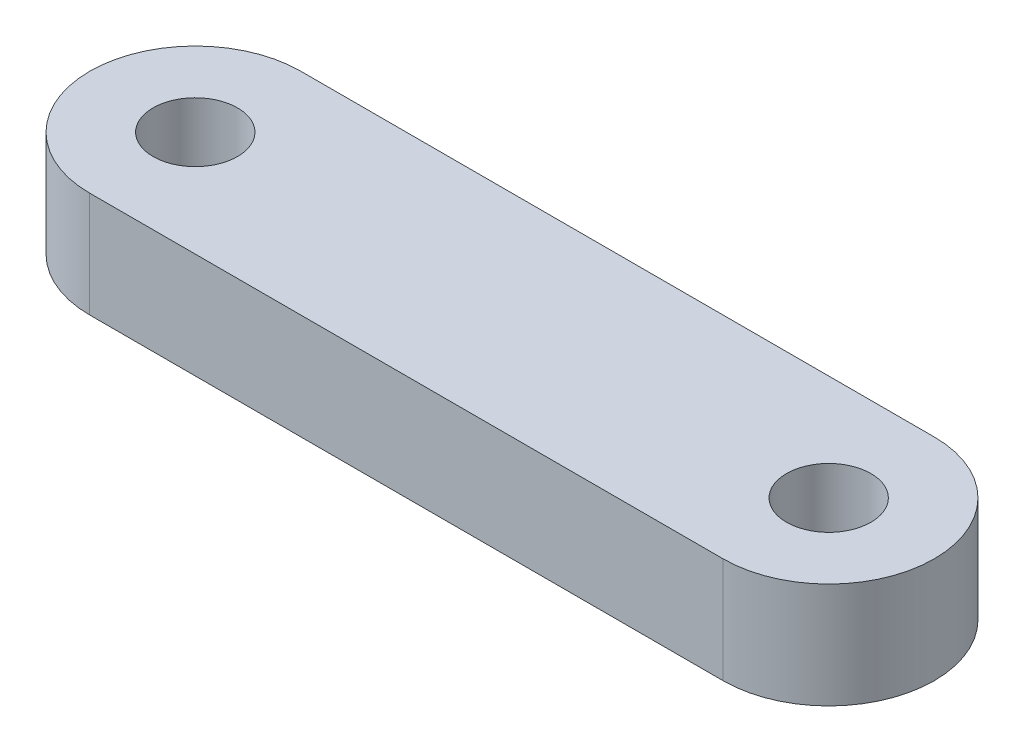
ISO-10303-21;
HEADER;
FILE_DESCRIPTION(('STEP AP214'),'2;1');
FILE_NAME('part.step','',(''),(''),'','','');
FILE_SCHEMA(('AUTOMOTIVE_DESIGN { 1 0 10303 214 1 1 1 1 }'));
ENDSEC;
DATA;
#1=APPLICATION_CONTEXT('core data for automotive mechanical design processes');
#2=APPLICATION_PROTOCOL_DEFINITION('international standard','automotive_design',2000,#1);
#3=PRODUCT_CONTEXT('',#1,'mechanical');
#4=PRODUCT('Part','Part','',(#3));
#5=PRODUCT_RELATED_PRODUCT_CATEGORY('part','',(#4));
#6=PRODUCT_DEFINITION_FORMATION('','',#4);
#7=PRODUCT_DEFINITION_CONTEXT('part definition',#1,'design');
#8=PRODUCT_DEFINITION('design','',#6,#7);
#9=PRODUCT_DEFINITION_SHAPE('','',#8);
#10=(LENGTH_UNIT() NAMED_UNIT(*) SI_UNIT(.MILLI.,.METRE.));
#11=(NAMED_UNIT(*) PLANE_ANGLE_UNIT() SI_UNIT($,.RADIAN.));
#12=(NAMED_UNIT(*) SI_UNIT($,.STERADIAN.) SOLID_ANGLE_UNIT());
#13=UNCERTAINTY_MEASURE_WITH_UNIT(LENGTH_MEASURE(1.E-05),#10,'distance_accuracy_value','');
#14=(GEOMETRIC_REPRESENTATION_CONTEXT(3) GLOBAL_UNCERTAINTY_ASSIGNED_CONTEXT((#13)) GLOBAL_UNIT_ASSIGNED_CONTEXT((#10,
#11,#12)) REPRESENTATION_CONTEXT('',''));
#15=CARTESIAN_POINT('',(0.,0.,0.));
#16=DIRECTION('',(0.,0.,1.));
#17=DIRECTION('',(1.,0.,0.));
#18=AXIS2_PLACEMENT_3D('',#15,#16,#17);
#19=CARTESIAN_POINT('',(-47.6382581670433,50.,0.));
#20=DIRECTION('',(0.,-1.,0.));
#21=DIRECTION('',(0.,0.,-1.));
#22=AXIS2_PLACEMENT_3D('',#19,#20,#21);
#23=CYLINDRICAL_SURFACE('',#22,50.);
#24=CARTESIAN_POINT('',(-47.6382581670433,0.,0.));
#25=DIRECTION('',(0.,1.,0.));
#26=DIRECTION('',(0.,0.,1.));
#27=AXIS2_PLACEMENT_3D('',#24,#25,#26);
#28=CIRCLE('',#27,50.);
#29=CARTESIAN_POINT('',(-47.6382581670433,0.,-50.));
#30=VERTEX_POINT('',#29);
#31=CARTESIAN_POINT('',(-47.6382581670433,0.,50.));
#32=VERTEX_POINT('',#31);
#33=EDGE_CURVE('E96',#30,#32,#28,.T.);
#34=ORIENTED_EDGE('',*,*,#33,.T.);
#35=DIRECTION('',(0.,-1.,0.));
#36=VECTOR('',#35,1.);
#37=CARTESIAN_POINT('',(-47.6382581670433,50.,50.));
#38=LINE('',#37,#36);
#39=CARTESIAN_POINT('',(-47.6382581670433,50.,50.));
#40=VERTEX_POINT('',#39);
#41=EDGE_CURVE('E11',#40,#32,#38,.T.);
#42=ORIENTED_EDGE('',*,*,#41,.F.);
#43=CARTESIAN_POINT('',(-47.6382581670433,50.,0.));
#44=DIRECTION('',(0.,1.,0.));
#45=DIRECTION('',(0.,0.,1.));
#46=AXIS2_PLACEMENT_3D('',#43,#44,#45);
#47=CIRCLE('',#46,50.);
#48=CARTESIAN_POINT('',(-47.6382581670433,50.,-50.));
#49=VERTEX_POINT('',#48);
#50=EDGE_CURVE('E84',#49,#40,#47,.T.);
#51=ORIENTED_EDGE('',*,*,#50,.F.);
#52=DIRECTION('',(0.,-1.,0.));
#53=VECTOR('',#52,1.);
#54=CARTESIAN_POINT('',(-47.6382581670433,50.,-50.));
#55=LINE('',#54,#53);
#56=EDGE_CURVE('E92',#49,#30,#55,.T.);
#57=ORIENTED_EDGE('',*,*,#56,.T.);
#58=EDGE_LOOP('',(#34,#42,#51,#57));
#59=FACE_BOUND('',#58,.T.);
#60=ADVANCED_FACE('F33',(#59),#23,.T.);
#61=CARTESIAN_POINT('',(-47.6382581670433,50.,50.));
#62=DIRECTION('',(0.,0.,-1.));
#63=DIRECTION('',(-1.,0.,0.));
#64=AXIS2_PLACEMENT_3D('',#61,#62,#63);
#65=PLANE('',#64);
#66=DIRECTION('',(1.,0.,0.));
#67=VECTOR('',#66,1.);
#68=CARTESIAN_POINT('',(-47.6382581670433,0.,50.));
#69=LINE('',#68,#67);
#70=CARTESIAN_POINT('',(252.361741832957,0.,50.));
#71=VERTEX_POINT('',#70);
#72=EDGE_CURVE('E88',#32,#71,#69,.T.);
#73=ORIENTED_EDGE('',*,*,#72,.T.);
#74=DIRECTION('',(0.,-1.,0.));
#75=VECTOR('',#74,1.);
#76=CARTESIAN_POINT('',(252.361741832957,50.,50.));
#77=LINE('',#76,#75);
#78=CARTESIAN_POINT('',(252.361741832957,50.,50.));
#79=VERTEX_POINT('',#78);
#80=EDGE_CURVE('E41',#79,#71,#77,.T.);
#81=ORIENTED_EDGE('',*,*,#80,.F.);
#82=DIRECTION('',(1.,0.,0.));
#83=VECTOR('',#82,1.);
#84=CARTESIAN_POINT('',(-47.6382581670433,50.,50.));
#85=LINE('',#84,#83);
#86=EDGE_CURVE('E79',#40,#79,#85,.T.);
#87=ORIENTED_EDGE('',*,*,#86,.F.);
#88=ORIENTED_EDGE('',*,*,#41,.T.);
#89=EDGE_LOOP('',(#73,#81,#87,#88));
#90=FACE_BOUND('',#89,.T.);
#91=ADVANCED_FACE('F87',(#90),#65,.F.);
#92=CARTESIAN_POINT('',(252.361741832957,50.,0.));
#93=DIRECTION('',(0.,-1.,0.));
#94=DIRECTION('',(0.,0.,-1.));
#95=AXIS2_PLACEMENT_3D('',#92,#93,#94);
#96=CYLINDRICAL_SURFACE('',#95,50.);
#97=CARTESIAN_POINT('',(252.361741832957,0.,0.));
#98=DIRECTION('',(0.,1.,0.));
#99=DIRECTION('',(0.,0.,1.));
#100=AXIS2_PLACEMENT_3D('',#97,#98,#99);
#101=CIRCLE('',#100,50.);
#102=CARTESIAN_POINT('',(252.361741832957,0.,-50.));
#103=VERTEX_POINT('',#102);
#104=EDGE_CURVE('E66',#71,#103,#101,.T.);
#105=ORIENTED_EDGE('',*,*,#104,.T.);
#106=DIRECTION('',(0.,-1.,0.));
#107=VECTOR('',#106,1.);
#108=CARTESIAN_POINT('',(252.361741832957,50.,-50.));
#109=LINE('',#108,#107);
#110=CARTESIAN_POINT('',(252.361741832957,50.,-50.));
#111=VERTEX_POINT('',#110);
#112=EDGE_CURVE('E89',#111,#103,#109,.T.);
#113=ORIENTED_EDGE('',*,*,#112,.F.);
#114=CARTESIAN_POINT('',(252.361741832957,50.,0.));
#115=DIRECTION('',(0.,1.,0.));
#116=DIRECTION('',(0.,0.,1.));
#117=AXIS2_PLACEMENT_3D('',#114,#115,#116);
#118=CIRCLE('',#117,50.);
#119=EDGE_CURVE('E82',#79,#111,#118,.T.);
#120=ORIENTED_EDGE('',*,*,#119,.F.);
#121=ORIENTED_EDGE('',*,*,#80,.T.);
#122=EDGE_LOOP('',(#105,#113,#120,#121));
#123=FACE_BOUND('',#122,.T.);
#124=ADVANCED_FACE('F90',(#123),#96,.T.);
#125=CARTESIAN_POINT('',(-47.6382581670433,50.,-50.));
#126=DIRECTION('',(0.,0.,1.));
#127=DIRECTION('',(1.,0.,0.));
#128=AXIS2_PLACEMENT_3D('',#125,#126,#127);
#129=PLANE('',#128);
#130=DIRECTION('',(-1.,0.,0.));
#131=VECTOR('',#130,1.);
#132=CARTESIAN_POINT('',(-47.6382581670433,0.,-50.));
#133=LINE('',#132,#131);
#134=EDGE_CURVE('E72',#103,#30,#133,.T.);
#135=ORIENTED_EDGE('',*,*,#134,.T.);
#136=ORIENTED_EDGE('',*,*,#56,.F.);
#137=DIRECTION('',(-1.,0.,0.));
#138=VECTOR('',#137,1.);
#139=CARTESIAN_POINT('',(-47.6382581670433,50.,-50.));
#140=LINE('',#139,#138);
#141=EDGE_CURVE('E49',#111,#49,#140,.T.);
#142=ORIENTED_EDGE('',*,*,#141,.F.);
#143=ORIENTED_EDGE('',*,*,#112,.T.);
#144=EDGE_LOOP('',(#135,#136,#142,#143));
#145=FACE_BOUND('',#144,.T.);
#146=ADVANCED_FACE('F104',(#145),#129,.F.);
#147=CARTESIAN_POINT('',(-47.6382581670433,50.,0.));
#148=DIRECTION('',(0.,1.,0.));
#149=DIRECTION('',(0.,0.,1.));
#150=AXIS2_PLACEMENT_3D('',#147,#148,#149);
#151=PLANE('',#150);
#152=CARTESIAN_POINT('',(252.361741832957,50.,0.));
#153=DIRECTION('',(0.,1.,0.));
#154=DIRECTION('',(0.,0.,1.));
#155=AXIS2_PLACEMENT_3D('',#152,#153,#154);
#156=CIRCLE('',#155,20.);
#157=CARTESIAN_POINT('',(252.361741832957,50.,20.));
#158=VERTEX_POINT('',#157);
#159=EDGE_CURVE('E116',#158,#158,#156,.T.);
#160=ORIENTED_EDGE('',*,*,#159,.F.);
#161=EDGE_LOOP('',(#160));
#162=FACE_BOUND('',#161,.T.);
#163=CARTESIAN_POINT('',(-47.6382581670433,50.,0.));
#164=DIRECTION('',(0.,1.,0.));
#165=DIRECTION('',(0.,0.,1.));
#166=AXIS2_PLACEMENT_3D('',#163,#164,#165);
#167=CIRCLE('',#166,20.);
#168=CARTESIAN_POINT('',(-47.6382581670433,50.,20.));
#169=VERTEX_POINT('',#168);
#170=EDGE_CURVE('E110',#169,#169,#167,.T.);
#171=ORIENTED_EDGE('',*,*,#170,.F.);
#172=EDGE_LOOP('',(#171));
#173=FACE_BOUND('',#172,.T.);
#174=ORIENTED_EDGE('',*,*,#50,.T.);
#175=ORIENTED_EDGE('',*,*,#86,.T.);
#176=ORIENTED_EDGE('',*,*,#119,.T.);
#177=ORIENTED_EDGE('',*,*,#141,.T.);
#178=EDGE_LOOP('',(#174,#175,#176,#177));
#179=FACE_BOUND('',#178,.T.);
#180=ADVANCED_FACE('F80',(#162,#173,#179),#151,.T.);
#181=CARTESIAN_POINT('',(-47.6382581670433,0.,0.));
#182=DIRECTION('',(0.,1.,0.));
#183=DIRECTION('',(0.,0.,1.));
#184=AXIS2_PLACEMENT_3D('',#181,#182,#183);
#185=PLANE('',#184);
#186=CARTESIAN_POINT('',(252.361741832957,0.,0.));
#187=DIRECTION('',(0.,1.,0.));
#188=DIRECTION('',(0.,0.,1.));
#189=AXIS2_PLACEMENT_3D('',#186,#187,#188);
#190=CIRCLE('',#189,20.);
#191=CARTESIAN_POINT('',(252.361741832957,0.,20.));
#192=VERTEX_POINT('',#191);
#193=EDGE_CURVE('E113',#192,#192,#190,.T.);
#194=ORIENTED_EDGE('',*,*,#193,.T.);
#195=EDGE_LOOP('',(#194));
#196=FACE_BOUND('',#195,.T.);
#197=CARTESIAN_POINT('',(-47.6382581670433,0.,0.));
#198=DIRECTION('',(0.,1.,0.));
#199=DIRECTION('',(0.,0.,1.));
#200=AXIS2_PLACEMENT_3D('',#197,#198,#199);
#201=CIRCLE('',#200,20.);
#202=CARTESIAN_POINT('',(-47.6382581670433,0.,20.));
#203=VERTEX_POINT('',#202);
#204=EDGE_CURVE('E99',#203,#203,#201,.T.);
#205=ORIENTED_EDGE('',*,*,#204,.T.);
#206=EDGE_LOOP('',(#205));
#207=FACE_BOUND('',#206,.T.);
#208=ORIENTED_EDGE('',*,*,#33,.F.);
#209=ORIENTED_EDGE('',*,*,#134,.F.);
#210=ORIENTED_EDGE('',*,*,#104,.F.);
#211=ORIENTED_EDGE('',*,*,#72,.F.);
#212=EDGE_LOOP('',(#208,#209,#210,#211));
#213=FACE_BOUND('',#212,.T.);
#214=ADVANCED_FACE('F107',(#196,#207,#213),#185,.F.);
#215=CARTESIAN_POINT('',(-47.6382581670433,0.,0.));
#216=DIRECTION('',(0.,1.,0.));
#217=DIRECTION('',(0.,0.,1.));
#218=AXIS2_PLACEMENT_3D('',#215,#216,#217);
#219=CYLINDRICAL_SURFACE('',#218,20.);
#220=ORIENTED_EDGE('',*,*,#204,.F.);
#221=EDGE_LOOP('',(#220));
#222=FACE_BOUND('',#221,.T.);
#223=ORIENTED_EDGE('',*,*,#170,.T.);
#224=EDGE_LOOP('',(#223));
#225=FACE_BOUND('',#224,.T.);
#226=ADVANCED_FACE('F127',(#222,#225),#219,.F.);
#227=CARTESIAN_POINT('',(252.361741832957,0.,0.));
#228=DIRECTION('',(0.,1.,0.));
#229=DIRECTION('',(0.,0.,1.));
#230=AXIS2_PLACEMENT_3D('',#227,#228,#229);
#231=CYLINDRICAL_SURFACE('',#230,20.);
#232=ORIENTED_EDGE('',*,*,#193,.F.);
#233=EDGE_LOOP('',(#232));
#234=FACE_BOUND('',#233,.T.);
#235=ORIENTED_EDGE('',*,*,#159,.T.);
#236=EDGE_LOOP('',(#235));
#237=FACE_BOUND('',#236,.T.);
#238=ADVANCED_FACE('F124',(#234,#237),#231,.F.);
#239=CLOSED_SHELL('',(#60,#91,#124,#146,#180,#214,#226,#238));
#240=MANIFOLD_SOLID_BREP('B2',#239);
#241=ADVANCED_BREP_SHAPE_REPRESENTATION('',(#18,#240),#14);
#242=SHAPE_DEFINITION_REPRESENTATION(#9,#241);
ENDSEC;
END-ISO-10303-21;
